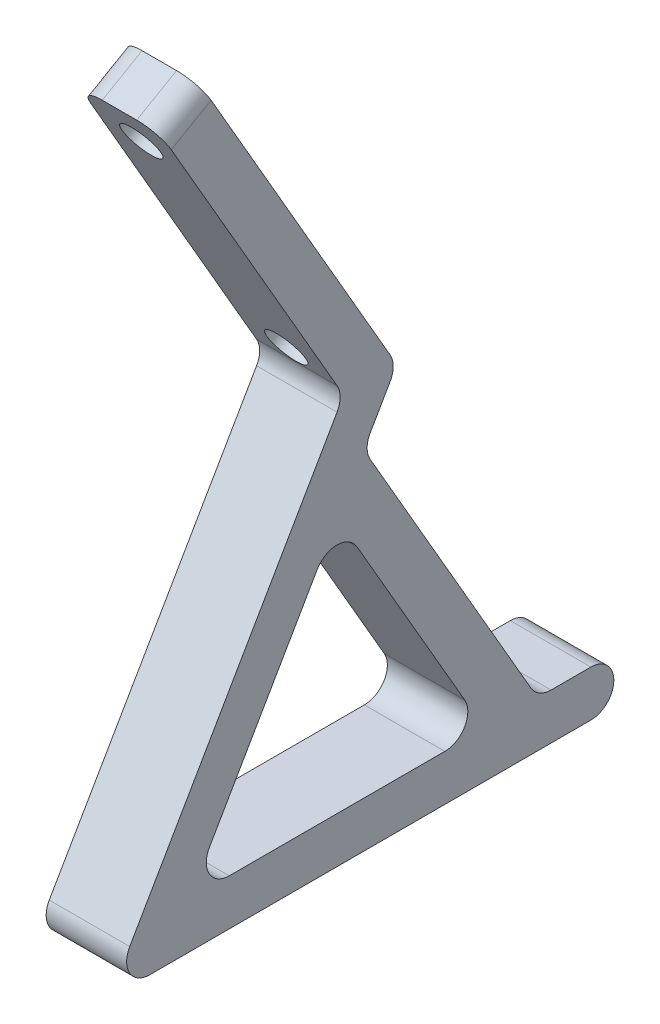
ISO-10303-21;
HEADER;
FILE_DESCRIPTION(('STEP AP214'),'2;1');
FILE_NAME('part.step','',(''),(''),'','','');
FILE_SCHEMA(('AUTOMOTIVE_DESIGN { 1 0 10303 214 1 1 1 1 }'));
ENDSEC;
DATA;
#1=APPLICATION_CONTEXT('core data for automotive mechanical design processes');
#2=APPLICATION_PROTOCOL_DEFINITION('international standard','automotive_design',2000,#1);
#3=PRODUCT_CONTEXT('',#1,'mechanical');
#4=PRODUCT('Part','Part','',(#3));
#5=PRODUCT_RELATED_PRODUCT_CATEGORY('part','',(#4));
#6=PRODUCT_DEFINITION_FORMATION('','',#4);
#7=PRODUCT_DEFINITION_CONTEXT('part definition',#1,'design');
#8=PRODUCT_DEFINITION('design','',#6,#7);
#9=PRODUCT_DEFINITION_SHAPE('','',#8);
#10=(LENGTH_UNIT() NAMED_UNIT(*) SI_UNIT(.MILLI.,.METRE.));
#11=(NAMED_UNIT(*) PLANE_ANGLE_UNIT() SI_UNIT($,.RADIAN.));
#12=(NAMED_UNIT(*) SI_UNIT($,.STERADIAN.) SOLID_ANGLE_UNIT());
#13=UNCERTAINTY_MEASURE_WITH_UNIT(LENGTH_MEASURE(1.E-05),#10,'distance_accuracy_value','');
#14=(GEOMETRIC_REPRESENTATION_CONTEXT(3) GLOBAL_UNCERTAINTY_ASSIGNED_CONTEXT((#13)) GLOBAL_UNIT_ASSIGNED_CONTEXT((#10,
#11,#12)) REPRESENTATION_CONTEXT('',''));
#15=CARTESIAN_POINT('',(0.,0.,0.));
#16=DIRECTION('',(0.,0.,1.));
#17=DIRECTION('',(1.,0.,0.));
#18=AXIS2_PLACEMENT_3D('',#15,#16,#17);
#19=CARTESIAN_POINT('',(7.,0.,0.));
#20=DIRECTION('',(-1.,0.,0.));
#21=DIRECTION('',(0.,0.,1.));
#22=AXIS2_PLACEMENT_3D('',#19,#20,#21);
#23=PLANE('',#22);
#24=DIRECTION('',(0.,0.866025403784437,-0.500000000000003));
#25=VECTOR('',#24,1.);
#26=CARTESIAN_POINT('',(7.,35.2390923627307,20.3452994616209));
#27=LINE('',#26,#25);
#28=CARTESIAN_POINT('',(7.,31.2390923627308,22.6547005383794));
#29=VERTEX_POINT('',#28);
#30=CARTESIAN_POINT('',(7.,34.2390923627307,20.9226497308105));
#31=VERTEX_POINT('',#30);
#32=EDGE_CURVE('E375',#29,#31,#27,.T.);
#33=ORIENTED_EDGE('',*,*,#32,.T.);
#34=CARTESIAN_POINT('',(7.,35.2390923627307,22.6547005383794));
#35=DIRECTION('',(-1.,0.,0.));
#36=DIRECTION('',(0.,0.,1.));
#37=AXIS2_PLACEMENT_3D('',#34,#35,#36);
#38=CIRCLE('',#37,2.);
#39=CARTESIAN_POINT('',(7.,36.2390923627308,20.9226497308105));
#40=VERTEX_POINT('',#39);
#41=EDGE_CURVE('E269',#31,#40,#38,.F.);
#42=ORIENTED_EDGE('',*,*,#41,.T.);
#43=DIRECTION('',(0.,0.866025403784436,0.500000000000005));
#44=VECTOR('',#43,1.);
#45=CARTESIAN_POINT('',(7.,64.9519052838327,37.5000000000003));
#46=LINE('',#45,#44);
#47=CARTESIAN_POINT('',(7.,63.2198544762639,36.5000000000003));
#48=VERTEX_POINT('',#47);
#49=EDGE_CURVE('E210',#40,#48,#46,.T.);
#50=ORIENTED_EDGE('',*,*,#49,.T.);
#51=DIRECTION('',(0.,-0.500000000000001,0.866025403784438));
#52=VECTOR('',#51,1.);
#53=CARTESIAN_POINT('',(7.,63.219854476264,36.5000000000001));
#54=LINE('',#53,#52);
#55=CARTESIAN_POINT('',(7.,61.2198544762639,39.9641016151381));
#56=VERTEX_POINT('',#55);
#57=EDGE_CURVE('E262',#48,#56,#54,.T.);
#58=ORIENTED_EDGE('',*,*,#57,.T.);
#59=DIRECTION('',(0.,-0.866025403784436,-0.500000000000005));
#60=VECTOR('',#59,1.);
#61=CARTESIAN_POINT('',(7.,62.9519052838327,40.9641016151381));
#62=LINE('',#61,#60);
#63=CARTESIAN_POINT('',(7.,36.2390923627308,25.5414518843275));
#64=VERTEX_POINT('',#63);
#65=EDGE_CURVE('E349',#56,#64,#62,.T.);
#66=ORIENTED_EDGE('',*,*,#65,.T.);
#67=CARTESIAN_POINT('',(7.,35.2390923627308,27.2735026918964));
#68=DIRECTION('',(-1.,0.,0.));
#69=DIRECTION('',(0.,0.,1.));
#70=AXIS2_PLACEMENT_3D('',#67,#68,#69);
#71=CIRCLE('',#70,2.);
#72=CARTESIAN_POINT('',(7.,34.2390923627307,25.5414518843275));
#73=VERTEX_POINT('',#72);
#74=EDGE_CURVE('E11',#64,#73,#71,.T.);
#75=ORIENTED_EDGE('',*,*,#74,.T.);
#76=DIRECTION('',(0.,-0.866025403784436,0.500000000000004));
#77=VECTOR('',#76,1.);
#78=CARTESIAN_POINT('',(7.,35.2390923627308,24.9641016151379));
#79=LINE('',#78,#77);
#80=CARTESIAN_POINT('',(7.,3.00000000000001,43.5773502691899));
#81=VERTEX_POINT('',#80);
#82=EDGE_CURVE('E347',#73,#81,#79,.T.);
#83=ORIENTED_EDGE('',*,*,#82,.T.);
#84=CARTESIAN_POINT('',(7.,2.,41.845299461621));
#85=DIRECTION('',(-1.,0.,0.));
#86=DIRECTION('',(0.,0.,1.));
#87=AXIS2_PLACEMENT_3D('',#84,#85,#86);
#88=CIRCLE('',#87,2.);
#89=CARTESIAN_POINT('',(7.,0.,41.845299461621));
#90=VERTEX_POINT('',#89);
#91=EDGE_CURVE('E260',#81,#90,#88,.F.);
#92=ORIENTED_EDGE('',*,*,#91,.T.);
#93=DIRECTION('',(0.,0.,-1.));
#94=VECTOR('',#93,1.);
#95=CARTESIAN_POINT('',(7.,0.,45.3094010767588));
#96=LINE('',#95,#94);
#97=CARTESIAN_POINT('',(7.,0.,3.46410161513777));
#98=VERTEX_POINT('',#97);
#99=EDGE_CURVE('E237',#90,#98,#96,.T.);
#100=ORIENTED_EDGE('',*,*,#99,.T.);
#101=CARTESIAN_POINT('',(7.,2.,3.46410161513777));
#102=DIRECTION('',(-1.,0.,0.));
#103=DIRECTION('',(0.,0.,1.));
#104=AXIS2_PLACEMENT_3D('',#101,#102,#103);
#105=CIRCLE('',#104,2.);
#106=CARTESIAN_POINT('',(7.,3.00000000000001,1.7320508075689));
#107=VERTEX_POINT('',#106);
#108=EDGE_CURVE('E265',#98,#107,#105,.F.);
#109=ORIENTED_EDGE('',*,*,#108,.T.);
#110=CARTESIAN_POINT('',(7.,2.,3.46410161513777));
#111=DIRECTION('',(-1.,0.,0.));
#112=DIRECTION('',(0.,0.,1.));
#113=AXIS2_PLACEMENT_3D('',#110,#111,#112);
#114=CIRCLE('',#113,2.);
#115=CARTESIAN_POINT('',(7.,4.,3.46410161513777));
#116=VERTEX_POINT('',#115);
#117=EDGE_CURVE('E267',#107,#116,#114,.F.);
#118=ORIENTED_EDGE('',*,*,#117,.T.);
#119=DIRECTION('',(0.,0.,1.));
#120=VECTOR('',#119,1.);
#121=CARTESIAN_POINT('',(7.,4.,8.0829037686548));
#122=LINE('',#121,#120);
#123=CARTESIAN_POINT('',(7.,4.,6.92820323027556));
#124=VERTEX_POINT('',#123);
#125=EDGE_CURVE('E233',#116,#124,#122,.T.);
#126=ORIENTED_EDGE('',*,*,#125,.T.);
#127=CARTESIAN_POINT('',(7.,6.,6.92820323027556));
#128=DIRECTION('',(-1.,0.,0.));
#129=DIRECTION('',(0.,0.,1.));
#130=AXIS2_PLACEMENT_3D('',#127,#128,#129);
#131=CIRCLE('',#130,2.);
#132=CARTESIAN_POINT('',(7.,5.,8.66025403784443));
#133=VERTEX_POINT('',#132);
#134=EDGE_CURVE('E320',#124,#133,#131,.T.);
#135=ORIENTED_EDGE('',*,*,#134,.T.);
#136=DIRECTION('',(0.,0.866025403784436,0.500000000000004));
#137=VECTOR('',#136,1.);
#138=CARTESIAN_POINT('',(7.,30.2390923627308,23.232050807569));
#139=LINE('',#138,#137);
#140=CARTESIAN_POINT('',(7.,29.2390923627308,22.6547005383794));
#141=VERTEX_POINT('',#140);
#142=EDGE_CURVE('E376',#133,#141,#139,.T.);
#143=ORIENTED_EDGE('',*,*,#142,.T.);
#144=CARTESIAN_POINT('',(7.,30.2390923627308,20.9226497308105));
#145=DIRECTION('',(-1.,0.,0.));
#146=DIRECTION('',(0.,0.,1.));
#147=AXIS2_PLACEMENT_3D('',#144,#145,#146);
#148=CIRCLE('',#147,2.);
#149=EDGE_CURVE('E316',#141,#29,#148,.T.);
#150=ORIENTED_EDGE('',*,*,#149,.T.);
#151=EDGE_LOOP('',(#33,#42,#50,#58,#66,#75,#83,#92,#100,#109,#118,#126,#135,#143,#150));
#152=FACE_BOUND('',#151,.T.);
#153=DIRECTION('',(0.,-0.866025403784437,0.500000000000003));
#154=VECTOR('',#153,1.);
#155=CARTESIAN_POINT('',(7.,26.2390923627308,25.5414518843275));
#156=LINE('',#155,#154);
#157=CARTESIAN_POINT('',(7.,23.2390923627308,27.2735026918964));
#158=VERTEX_POINT('',#157);
#159=CARTESIAN_POINT('',(7.,7.,36.6491470389143));
#160=VERTEX_POINT('',#159);
#161=EDGE_CURVE('E387',#158,#160,#156,.T.);
#162=ORIENTED_EDGE('',*,*,#161,.F.);
#163=CARTESIAN_POINT('',(7.,22.2390923627308,25.5414518843275));
#164=DIRECTION('',(-1.,0.,0.));
#165=DIRECTION('',(0.,0.,1.));
#166=AXIS2_PLACEMENT_3D('',#163,#164,#165);
#167=CIRCLE('',#166,2.);
#168=CARTESIAN_POINT('',(7.,23.2390923627308,23.8094010767587));
#169=VERTEX_POINT('',#168);
#170=EDGE_CURVE('E332',#158,#169,#167,.T.);
#171=ORIENTED_EDGE('',*,*,#170,.T.);
#172=DIRECTION('',(0.,0.866025403784437,0.500000000000004));
#173=VECTOR('',#172,1.);
#174=CARTESIAN_POINT('',(7.,4.,12.7017059221718));
#175=LINE('',#174,#173);
#176=CARTESIAN_POINT('',(7.,7.00000000000001,14.4337567297407));
#177=VERTEX_POINT('',#176);
#178=EDGE_CURVE('E361',#177,#169,#175,.T.);
#179=ORIENTED_EDGE('',*,*,#178,.F.);
#180=CARTESIAN_POINT('',(7.,6.,16.1658075373096));
#181=DIRECTION('',(-1.,0.,0.));
#182=DIRECTION('',(0.,0.,1.));
#183=AXIS2_PLACEMENT_3D('',#180,#181,#182);
#184=CIRCLE('',#183,2.);
#185=CARTESIAN_POINT('',(7.,4.,16.1658075373096));
#186=VERTEX_POINT('',#185);
#187=EDGE_CURVE('E328',#177,#186,#184,.T.);
#188=ORIENTED_EDGE('',*,*,#187,.T.);
#189=DIRECTION('',(0.,0.,-1.));
#190=VECTOR('',#189,1.);
#191=CARTESIAN_POINT('',(7.,3.99999999999999,38.3811978464832));
#192=LINE('',#191,#190);
#193=CARTESIAN_POINT('',(7.,3.99999999999999,34.9170962313455));
#194=VERTEX_POINT('',#193);
#195=EDGE_CURVE('E395',#194,#186,#192,.T.);
#196=ORIENTED_EDGE('',*,*,#195,.F.);
#197=CARTESIAN_POINT('',(7.,5.99999999999999,34.9170962313455));
#198=DIRECTION('',(-1.,0.,0.));
#199=DIRECTION('',(0.,0.,1.));
#200=AXIS2_PLACEMENT_3D('',#197,#198,#199);
#201=CIRCLE('',#200,2.);
#202=EDGE_CURVE('E324',#194,#160,#201,.T.);
#203=ORIENTED_EDGE('',*,*,#202,.T.);
#204=EDGE_LOOP('',(#162,#171,#179,#188,#196,#203));
#205=FACE_BOUND('',#204,.T.);
#206=ADVANCED_FACE('F33',(#152,#205),#23,.F.);
#207=CARTESIAN_POINT('',(0.,0.,0.));
#208=DIRECTION('',(-1.,0.,0.));
#209=DIRECTION('',(0.,0.,1.));
#210=AXIS2_PLACEMENT_3D('',#207,#208,#209);
#211=PLANE('',#210);
#212=DIRECTION('',(0.,0.866025403784436,0.500000000000005));
#213=VECTOR('',#212,1.);
#214=CARTESIAN_POINT('',(0.,64.9519052838327,37.5000000000003));
#215=LINE('',#214,#213);
#216=CARTESIAN_POINT('',(0.,36.2390923627308,20.9226497308105));
#217=VERTEX_POINT('',#216);
#218=CARTESIAN_POINT('',(0.,63.2198544762639,36.5000000000003));
#219=VERTEX_POINT('',#218);
#220=EDGE_CURVE('E207',#217,#219,#215,.T.);
#221=ORIENTED_EDGE('',*,*,#220,.F.);
#222=CARTESIAN_POINT('',(0.,35.2390923627307,22.6547005383794));
#223=DIRECTION('',(-1.,0.,0.));
#224=DIRECTION('',(0.,0.,1.));
#225=AXIS2_PLACEMENT_3D('',#222,#223,#224);
#226=CIRCLE('',#225,2.);
#227=CARTESIAN_POINT('',(0.,34.2390923627307,20.9226497308105));
#228=VERTEX_POINT('',#227);
#229=EDGE_CURVE('E190',#217,#228,#226,.T.);
#230=ORIENTED_EDGE('',*,*,#229,.T.);
#231=DIRECTION('',(0.,0.866025403784437,-0.500000000000003));
#232=VECTOR('',#231,1.);
#233=CARTESIAN_POINT('',(0.,35.2390923627307,20.3452994616209));
#234=LINE('',#233,#232);
#235=CARTESIAN_POINT('',(0.,31.2390923627308,22.6547005383794));
#236=VERTEX_POINT('',#235);
#237=EDGE_CURVE('E219',#236,#228,#234,.T.);
#238=ORIENTED_EDGE('',*,*,#237,.F.);
#239=CARTESIAN_POINT('',(0.,30.2390923627308,20.9226497308105));
#240=DIRECTION('',(-1.,0.,0.));
#241=DIRECTION('',(0.,0.,1.));
#242=AXIS2_PLACEMENT_3D('',#239,#240,#241);
#243=CIRCLE('',#242,2.);
#244=CARTESIAN_POINT('',(0.,29.2390923627308,22.6547005383794));
#245=VERTEX_POINT('',#244);
#246=EDGE_CURVE('E314',#236,#245,#243,.F.);
#247=ORIENTED_EDGE('',*,*,#246,.T.);
#248=DIRECTION('',(0.,0.866025403784436,0.500000000000004));
#249=VECTOR('',#248,1.);
#250=CARTESIAN_POINT('',(0.,30.2390923627308,23.232050807569));
#251=LINE('',#250,#249);
#252=CARTESIAN_POINT('',(0.,5.,8.66025403784443));
#253=VERTEX_POINT('',#252);
#254=EDGE_CURVE('E224',#253,#245,#251,.T.);
#255=ORIENTED_EDGE('',*,*,#254,.F.);
#256=CARTESIAN_POINT('',(0.,6.,6.92820323027556));
#257=DIRECTION('',(-1.,0.,0.));
#258=DIRECTION('',(0.,0.,1.));
#259=AXIS2_PLACEMENT_3D('',#256,#257,#258);
#260=CIRCLE('',#259,2.);
#261=CARTESIAN_POINT('',(0.,4.,6.92820323027556));
#262=VERTEX_POINT('',#261);
#263=EDGE_CURVE('E318',#253,#262,#260,.F.);
#264=ORIENTED_EDGE('',*,*,#263,.T.);
#265=DIRECTION('',(0.,0.,1.));
#266=VECTOR('',#265,1.);
#267=CARTESIAN_POINT('',(0.,4.,8.0829037686548));
#268=LINE('',#267,#266);
#269=CARTESIAN_POINT('',(0.,4.,3.46410161513777));
#270=VERTEX_POINT('',#269);
#271=EDGE_CURVE('E359',#270,#262,#268,.T.);
#272=ORIENTED_EDGE('',*,*,#271,.F.);
#273=CARTESIAN_POINT('',(0.,2.,3.46410161513777));
#274=DIRECTION('',(-1.,0.,0.));
#275=DIRECTION('',(0.,0.,1.));
#276=AXIS2_PLACEMENT_3D('',#273,#274,#275);
#277=CIRCLE('',#276,2.);
#278=CARTESIAN_POINT('',(0.,3.00000000000001,1.7320508075689));
#279=VERTEX_POINT('',#278);
#280=EDGE_CURVE('E201',#270,#279,#277,.T.);
#281=ORIENTED_EDGE('',*,*,#280,.T.);
#282=CARTESIAN_POINT('',(0.,2.,3.46410161513777));
#283=DIRECTION('',(-1.,0.,0.));
#284=DIRECTION('',(0.,0.,1.));
#285=AXIS2_PLACEMENT_3D('',#282,#283,#284);
#286=CIRCLE('',#285,2.);
#287=CARTESIAN_POINT('',(0.,0.,3.46410161513777));
#288=VERTEX_POINT('',#287);
#289=EDGE_CURVE('E254',#279,#288,#286,.T.);
#290=ORIENTED_EDGE('',*,*,#289,.T.);
#291=DIRECTION('',(0.,0.,-1.));
#292=VECTOR('',#291,1.);
#293=CARTESIAN_POINT('',(0.,0.,45.3094010767588));
#294=LINE('',#293,#292);
#295=CARTESIAN_POINT('',(0.,0.,41.845299461621));
#296=VERTEX_POINT('',#295);
#297=EDGE_CURVE('E230',#296,#288,#294,.T.);
#298=ORIENTED_EDGE('',*,*,#297,.F.);
#299=CARTESIAN_POINT('',(0.,2.,41.845299461621));
#300=DIRECTION('',(-1.,0.,0.));
#301=DIRECTION('',(0.,0.,1.));
#302=AXIS2_PLACEMENT_3D('',#299,#300,#301);
#303=CIRCLE('',#302,2.);
#304=CARTESIAN_POINT('',(0.,3.00000000000001,43.5773502691899));
#305=VERTEX_POINT('',#304);
#306=EDGE_CURVE('E211',#296,#305,#303,.T.);
#307=ORIENTED_EDGE('',*,*,#306,.T.);
#308=DIRECTION('',(0.,-0.866025403784436,0.500000000000004));
#309=VECTOR('',#308,1.);
#310=CARTESIAN_POINT('',(0.,35.2390923627308,24.9641016151379));
#311=LINE('',#310,#309);
#312=CARTESIAN_POINT('',(0.,34.2390923627307,25.5414518843275));
#313=VERTEX_POINT('',#312);
#314=EDGE_CURVE('E222',#313,#305,#311,.T.);
#315=ORIENTED_EDGE('',*,*,#314,.F.);
#316=CARTESIAN_POINT('',(0.,35.2390923627308,27.2735026918964));
#317=DIRECTION('',(-1.,0.,0.));
#318=DIRECTION('',(0.,0.,1.));
#319=AXIS2_PLACEMENT_3D('',#316,#317,#318);
#320=CIRCLE('',#319,2.);
#321=CARTESIAN_POINT('',(0.,36.2390923627308,25.5414518843275));
#322=VERTEX_POINT('',#321);
#323=EDGE_CURVE('E42',#313,#322,#320,.F.);
#324=ORIENTED_EDGE('',*,*,#323,.T.);
#325=DIRECTION('',(0.,-0.866025403784436,-0.500000000000005));
#326=VECTOR('',#325,1.);
#327=CARTESIAN_POINT('',(0.,62.9519052838327,40.9641016151381));
#328=LINE('',#327,#326);
#329=CARTESIAN_POINT('',(0.,61.2198544762639,39.9641016151381));
#330=VERTEX_POINT('',#329);
#331=EDGE_CURVE('E218',#330,#322,#328,.T.);
#332=ORIENTED_EDGE('',*,*,#331,.F.);
#333=DIRECTION('',(0.,-0.500000000000001,0.866025403784438));
#334=VECTOR('',#333,1.);
#335=CARTESIAN_POINT('',(0.,63.2198544762639,36.5000000000003));
#336=LINE('',#335,#334);
#337=EDGE_CURVE('E217',#330,#219,#336,.F.);
#338=ORIENTED_EDGE('',*,*,#337,.T.);
#339=EDGE_LOOP('',(#221,#230,#238,#247,#255,#264,#272,#281,#290,#298,#307,#315,#324,#332,#338));
#340=FACE_BOUND('',#339,.T.);
#341=DIRECTION('',(0.,0.,-1.));
#342=VECTOR('',#341,1.);
#343=CARTESIAN_POINT('',(0.,3.99999999999999,38.3811978464832));
#344=LINE('',#343,#342);
#345=CARTESIAN_POINT('',(0.,3.99999999999999,34.9170962313455));
#346=VERTEX_POINT('',#345);
#347=CARTESIAN_POINT('',(0.,4.,16.1658075373096));
#348=VERTEX_POINT('',#347);
#349=EDGE_CURVE('E388',#346,#348,#344,.T.);
#350=ORIENTED_EDGE('',*,*,#349,.T.);
#351=CARTESIAN_POINT('',(0.,6.,16.1658075373096));
#352=DIRECTION('',(-1.,0.,0.));
#353=DIRECTION('',(0.,0.,1.));
#354=AXIS2_PLACEMENT_3D('',#351,#352,#353);
#355=CIRCLE('',#354,2.);
#356=CARTESIAN_POINT('',(0.,7.00000000000001,14.4337567297407));
#357=VERTEX_POINT('',#356);
#358=EDGE_CURVE('E326',#348,#357,#355,.F.);
#359=ORIENTED_EDGE('',*,*,#358,.T.);
#360=DIRECTION('',(0.,0.866025403784437,0.500000000000004));
#361=VECTOR('',#360,1.);
#362=CARTESIAN_POINT('',(0.,4.,12.7017059221718));
#363=LINE('',#362,#361);
#364=CARTESIAN_POINT('',(0.,23.2390923627308,23.8094010767587));
#365=VERTEX_POINT('',#364);
#366=EDGE_CURVE('E384',#357,#365,#363,.T.);
#367=ORIENTED_EDGE('',*,*,#366,.T.);
#368=CARTESIAN_POINT('',(0.,22.2390923627308,25.5414518843275));
#369=DIRECTION('',(-1.,0.,0.));
#370=DIRECTION('',(0.,0.,1.));
#371=AXIS2_PLACEMENT_3D('',#368,#369,#370);
#372=CIRCLE('',#371,2.);
#373=CARTESIAN_POINT('',(0.,23.2390923627308,27.2735026918964));
#374=VERTEX_POINT('',#373);
#375=EDGE_CURVE('E330',#365,#374,#372,.F.);
#376=ORIENTED_EDGE('',*,*,#375,.T.);
#377=DIRECTION('',(0.,-0.866025403784437,0.500000000000003));
#378=VECTOR('',#377,1.);
#379=CARTESIAN_POINT('',(0.,26.2390923627308,25.5414518843275));
#380=LINE('',#379,#378);
#381=CARTESIAN_POINT('',(0.,7.,36.6491470389143));
#382=VERTEX_POINT('',#381);
#383=EDGE_CURVE('E244',#374,#382,#380,.T.);
#384=ORIENTED_EDGE('',*,*,#383,.T.);
#385=CARTESIAN_POINT('',(0.,5.99999999999999,34.9170962313455));
#386=DIRECTION('',(-1.,0.,0.));
#387=DIRECTION('',(0.,0.,1.));
#388=AXIS2_PLACEMENT_3D('',#385,#386,#387);
#389=CIRCLE('',#388,2.);
#390=EDGE_CURVE('E322',#382,#346,#389,.F.);
#391=ORIENTED_EDGE('',*,*,#390,.T.);
#392=EDGE_LOOP('',(#350,#359,#367,#376,#384,#391));
#393=FACE_BOUND('',#392,.T.);
#394=ADVANCED_FACE('F214',(#340,#393),#211,.T.);
#395=CARTESIAN_POINT('',(7.,4.,8.0829037686548));
#396=DIRECTION('',(0.,-1.,0.));
#397=DIRECTION('',(0.,0.,-1.));
#398=AXIS2_PLACEMENT_3D('',#395,#396,#397);
#399=PLANE('',#398);
#400=ORIENTED_EDGE('',*,*,#271,.T.);
#401=DIRECTION('',(-1.,0.,0.));
#402=VECTOR('',#401,1.);
#403=CARTESIAN_POINT('',(7.,4.,6.92820323027556));
#404=LINE('',#403,#402);
#405=EDGE_CURVE('E279',#262,#124,#404,.F.);
#406=ORIENTED_EDGE('',*,*,#405,.T.);
#407=ORIENTED_EDGE('',*,*,#125,.F.);
#408=DIRECTION('',(-1.,0.,0.));
#409=VECTOR('',#408,1.);
#410=CARTESIAN_POINT('',(7.,4.,3.46410161513777));
#411=LINE('',#410,#409);
#412=EDGE_CURVE('E276',#116,#270,#411,.T.);
#413=ORIENTED_EDGE('',*,*,#412,.T.);
#414=EDGE_LOOP('',(#400,#406,#407,#413));
#415=FACE_BOUND('',#414,.T.);
#416=ADVANCED_FACE('F426',(#415),#399,.F.);
#417=CARTESIAN_POINT('',(7.,30.2390923627308,23.232050807569));
#418=DIRECTION('',(0.,-0.500000000000004,0.866025403784436));
#419=DIRECTION('',(0.,-0.866025403784437,-0.500000000000004));
#420=AXIS2_PLACEMENT_3D('',#417,#418,#419);
#421=PLANE('',#420);
#422=ORIENTED_EDGE('',*,*,#254,.T.);
#423=DIRECTION('',(-1.,0.,0.));
#424=VECTOR('',#423,1.);
#425=CARTESIAN_POINT('',(7.,29.2390923627308,22.6547005383794));
#426=LINE('',#425,#424);
#427=EDGE_CURVE('E274',#245,#141,#426,.F.);
#428=ORIENTED_EDGE('',*,*,#427,.T.);
#429=ORIENTED_EDGE('',*,*,#142,.F.);
#430=DIRECTION('',(-1.,0.,0.));
#431=VECTOR('',#430,1.);
#432=CARTESIAN_POINT('',(0.,4.99999999999999,8.66025403784443));
#433=LINE('',#432,#431);
#434=EDGE_CURVE('E271',#133,#253,#433,.T.);
#435=ORIENTED_EDGE('',*,*,#434,.T.);
#436=EDGE_LOOP('',(#422,#428,#429,#435));
#437=FACE_BOUND('',#436,.T.);
#438=ADVANCED_FACE('F366',(#437),#421,.F.);
#439=CARTESIAN_POINT('',(7.,35.2390923627307,20.3452994616209));
#440=DIRECTION('',(0.,0.500000000000003,0.866025403784437));
#441=DIRECTION('',(0.,-0.866025403784437,0.500000000000003));
#442=AXIS2_PLACEMENT_3D('',#439,#440,#441);
#443=PLANE('',#442);
#444=ORIENTED_EDGE('',*,*,#237,.T.);
#445=DIRECTION('',(-1.,0.,0.));
#446=VECTOR('',#445,1.);
#447=CARTESIAN_POINT('',(7.,34.2390923627307,20.9226497308105));
#448=LINE('',#447,#446);
#449=EDGE_CURVE('E195',#228,#31,#448,.F.);
#450=ORIENTED_EDGE('',*,*,#449,.T.);
#451=ORIENTED_EDGE('',*,*,#32,.F.);
#452=DIRECTION('',(-1.,0.,0.));
#453=VECTOR('',#452,1.);
#454=CARTESIAN_POINT('',(0.,31.2390923627308,22.6547005383794));
#455=LINE('',#454,#453);
#456=EDGE_CURVE('E200',#29,#236,#455,.T.);
#457=ORIENTED_EDGE('',*,*,#456,.T.);
#458=EDGE_LOOP('',(#444,#450,#451,#457));
#459=FACE_BOUND('',#458,.T.);
#460=ADVANCED_FACE('F378',(#459),#443,.F.);
#461=CARTESIAN_POINT('',(7.,64.9519052838327,37.5000000000003));
#462=DIRECTION('',(0.,-0.500000000000005,0.866025403784436));
#463=DIRECTION('',(0.,-0.866025403784436,-0.500000000000005));
#464=AXIS2_PLACEMENT_3D('',#461,#462,#463);
#465=PLANE('',#464);
#466=CARTESIAN_POINT('',(3.49999999999999,61.6610087494518,35.6000000000003));
#467=DIRECTION('',(0.,0.500000000000005,-0.866025403784436));
#468=DIRECTION('',(0.,0.866025403784436,0.500000000000005));
#469=AXIS2_PLACEMENT_3D('',#466,#467,#468);
#470=CIRCLE('',#469,1.69999999999999);
#471=CARTESIAN_POINT('',(3.49999999999999,63.1332519358854,36.4500000000003));
#472=VERTEX_POINT('',#471);
#473=EDGE_CURVE('E249',#472,#472,#470,.T.);
#474=ORIENTED_EDGE('',*,*,#473,.F.);
#475=EDGE_LOOP('',(#474));
#476=FACE_BOUND('',#475,.T.);
#477=CARTESIAN_POINT('',(3.49999999999999,39.8371685740841,23.0000000000002));
#478=DIRECTION('',(0.,0.500000000000005,-0.866025403784436));
#479=DIRECTION('',(0.,0.866025403784436,0.500000000000005));
#480=AXIS2_PLACEMENT_3D('',#477,#478,#479);
#481=CIRCLE('',#480,1.69999999999999);
#482=CARTESIAN_POINT('',(3.49999999999999,41.3094117605176,23.8500000000002));
#483=VERTEX_POINT('',#482);
#484=EDGE_CURVE('E245',#483,#483,#481,.T.);
#485=ORIENTED_EDGE('',*,*,#484,.F.);
#486=EDGE_LOOP('',(#485));
#487=FACE_BOUND('',#486,.T.);
#488=ORIENTED_EDGE('',*,*,#49,.F.);
#489=DIRECTION('',(-1.,0.,0.));
#490=VECTOR('',#489,1.);
#491=CARTESIAN_POINT('',(7.,36.2390923627308,20.9226497308105));
#492=LINE('',#491,#490);
#493=EDGE_CURVE('E194',#40,#217,#492,.T.);
#494=ORIENTED_EDGE('',*,*,#493,.T.);
#495=ORIENTED_EDGE('',*,*,#220,.T.);
#496=CARTESIAN_POINT('',(2.,63.2198544762639,36.5000000000003));
#497=DIRECTION('',(0.,-0.500000000000005,0.866025403784436));
#498=DIRECTION('',(0.,-0.866025403784436,-0.500000000000005));
#499=AXIS2_PLACEMENT_3D('',#496,#497,#498);
#500=CIRCLE('',#499,2.);
#501=CARTESIAN_POINT('',(2.,64.9519052838327,37.5000000000003));
#502=VERTEX_POINT('',#501);
#503=EDGE_CURVE('E240',#219,#502,#500,.F.);
#504=ORIENTED_EDGE('',*,*,#503,.T.);
#505=DIRECTION('',(-1.,0.,0.));
#506=VECTOR('',#505,1.);
#507=CARTESIAN_POINT('',(7.,64.9519052838327,37.5000000000003));
#508=LINE('',#507,#506);
#509=CARTESIAN_POINT('',(5.,64.9519052838327,37.5000000000003));
#510=VERTEX_POINT('',#509);
#511=EDGE_CURVE('E236',#510,#502,#508,.T.);
#512=ORIENTED_EDGE('',*,*,#511,.F.);
#513=CARTESIAN_POINT('',(5.,63.2198544762639,36.5000000000003));
#514=DIRECTION('',(0.,-0.500000000000005,0.866025403784436));
#515=DIRECTION('',(0.,-0.866025403784436,-0.500000000000005));
#516=AXIS2_PLACEMENT_3D('',#513,#514,#515);
#517=CIRCLE('',#516,2.);
#518=EDGE_CURVE('E212',#510,#48,#517,.F.);
#519=ORIENTED_EDGE('',*,*,#518,.T.);
#520=EDGE_LOOP('',(#488,#494,#495,#504,#512,#519));
#521=FACE_BOUND('',#520,.T.);
#522=ADVANCED_FACE('F206',(#476,#487,#521),#465,.F.);
#523=CARTESIAN_POINT('',(7.,64.9519052838327,37.5000000000003));
#524=DIRECTION('',(0.,-0.866025403784438,-0.500000000000001));
#525=DIRECTION('',(0.,0.500000000000001,-0.866025403784438));
#526=AXIS2_PLACEMENT_3D('',#523,#524,#525);
#527=PLANE('',#526);
#528=DIRECTION('',(-1.,0.,0.));
#529=VECTOR('',#528,1.);
#530=CARTESIAN_POINT('',(7.,62.9519052838327,40.9641016151381));
#531=LINE('',#530,#529);
#532=CARTESIAN_POINT('',(5.,62.9519052838327,40.9641016151381));
#533=VERTEX_POINT('',#532);
#534=CARTESIAN_POINT('',(2.,62.9519052838327,40.9641016151381));
#535=VERTEX_POINT('',#534);
#536=EDGE_CURVE('E234',#533,#535,#531,.T.);
#537=ORIENTED_EDGE('',*,*,#536,.F.);
#538=DIRECTION('',(0.,-0.500000000000001,0.866025403784438));
#539=VECTOR('',#538,1.);
#540=CARTESIAN_POINT('',(5.,64.9519052838327,37.5000000000003));
#541=LINE('',#540,#539);
#542=EDGE_CURVE('E292',#533,#510,#541,.F.);
#543=ORIENTED_EDGE('',*,*,#542,.T.);
#544=ORIENTED_EDGE('',*,*,#511,.T.);
#545=DIRECTION('',(0.,-0.500000000000001,0.866025403784438));
#546=VECTOR('',#545,1.);
#547=CARTESIAN_POINT('',(2.,62.9519052838327,40.9641016151381));
#548=LINE('',#547,#546);
#549=EDGE_CURVE('E290',#502,#535,#548,.T.);
#550=ORIENTED_EDGE('',*,*,#549,.T.);
#551=EDGE_LOOP('',(#537,#543,#544,#550));
#552=FACE_BOUND('',#551,.T.);
#553=ADVANCED_FACE('F455',(#552),#527,.F.);
#554=CARTESIAN_POINT('',(7.,62.9519052838327,40.9641016151381));
#555=DIRECTION('',(0.,0.500000000000005,-0.866025403784436));
#556=DIRECTION('',(0.,0.866025403784436,0.500000000000005));
#557=AXIS2_PLACEMENT_3D('',#554,#555,#556);
#558=PLANE('',#557);
#559=CARTESIAN_POINT('',(3.49999999999999,59.6610087494518,39.064101615138));
#560=DIRECTION('',(0.,0.500000000000005,-0.866025403784436));
#561=DIRECTION('',(0.,0.866025403784436,0.500000000000005));
#562=AXIS2_PLACEMENT_3D('',#559,#560,#561);
#563=CIRCLE('',#562,1.69999999999999);
#564=CARTESIAN_POINT('',(3.49999999999999,61.1332519358854,39.914101615138));
#565=VERTEX_POINT('',#564);
#566=EDGE_CURVE('E246',#565,#565,#563,.T.);
#567=ORIENTED_EDGE('',*,*,#566,.T.);
#568=EDGE_LOOP('',(#567));
#569=FACE_BOUND('',#568,.T.);
#570=CARTESIAN_POINT('',(3.49999999999999,37.8371685740841,26.4641016151379));
#571=DIRECTION('',(0.,0.500000000000005,-0.866025403784436));
#572=DIRECTION('',(0.,0.866025403784436,0.500000000000005));
#573=AXIS2_PLACEMENT_3D('',#570,#571,#572);
#574=CIRCLE('',#573,1.69999999999999);
#575=CARTESIAN_POINT('',(3.49999999999999,39.3094117605176,27.3141016151379));
#576=VERTEX_POINT('',#575);
#577=EDGE_CURVE('E241',#576,#576,#574,.T.);
#578=ORIENTED_EDGE('',*,*,#577,.T.);
#579=EDGE_LOOP('',(#578));
#580=FACE_BOUND('',#579,.T.);
#581=ORIENTED_EDGE('',*,*,#65,.F.);
#582=CARTESIAN_POINT('',(5.,61.2198544762639,39.9641016151381));
#583=DIRECTION('',(0.,0.500000000000005,-0.866025403784436));
#584=DIRECTION('',(0.,0.866025403784436,0.500000000000005));
#585=AXIS2_PLACEMENT_3D('',#582,#583,#584);
#586=CIRCLE('',#585,2.);
#587=EDGE_CURVE('E57',#56,#533,#586,.F.);
#588=ORIENTED_EDGE('',*,*,#587,.T.);
#589=ORIENTED_EDGE('',*,*,#536,.T.);
#590=CARTESIAN_POINT('',(2.,61.2198544762639,39.9641016151381));
#591=DIRECTION('',(0.,0.500000000000005,-0.866025403784436));
#592=DIRECTION('',(0.,0.866025403784436,0.500000000000005));
#593=AXIS2_PLACEMENT_3D('',#590,#591,#592);
#594=CIRCLE('',#593,2.);
#595=EDGE_CURVE('E49',#535,#330,#594,.F.);
#596=ORIENTED_EDGE('',*,*,#595,.T.);
#597=ORIENTED_EDGE('',*,*,#331,.T.);
#598=DIRECTION('',(-1.,0.,0.));
#599=VECTOR('',#598,1.);
#600=CARTESIAN_POINT('',(7.,36.2390923627308,25.5414518843276));
#601=LINE('',#600,#599);
#602=EDGE_CURVE('E286',#322,#64,#601,.F.);
#603=ORIENTED_EDGE('',*,*,#602,.T.);
#604=EDGE_LOOP('',(#581,#588,#589,#596,#597,#603));
#605=FACE_BOUND('',#604,.T.);
#606=ADVANCED_FACE('F338',(#569,#580,#605),#558,.F.);
#607=CARTESIAN_POINT('',(7.,35.2390923627308,24.9641016151379));
#608=DIRECTION('',(0.,-0.500000000000004,-0.866025403784436));
#609=DIRECTION('',(0.,0.866025403784436,-0.500000000000004));
#610=AXIS2_PLACEMENT_3D('',#607,#608,#609);
#611=PLANE('',#610);
#612=ORIENTED_EDGE('',*,*,#82,.F.);
#613=DIRECTION('',(-1.,0.,0.));
#614=VECTOR('',#613,1.);
#615=CARTESIAN_POINT('',(0.,34.2390923627307,25.5414518843275));
#616=LINE('',#615,#614);
#617=EDGE_CURVE('E311',#73,#313,#616,.T.);
#618=ORIENTED_EDGE('',*,*,#617,.T.);
#619=ORIENTED_EDGE('',*,*,#314,.T.);
#620=DIRECTION('',(-1.,0.,0.));
#621=VECTOR('',#620,1.);
#622=CARTESIAN_POINT('',(7.,3.00000000000001,43.5773502691899));
#623=LINE('',#622,#621);
#624=EDGE_CURVE('E309',#305,#81,#623,.F.);
#625=ORIENTED_EDGE('',*,*,#624,.T.);
#626=EDGE_LOOP('',(#612,#618,#619,#625));
#627=FACE_BOUND('',#626,.T.);
#628=ADVANCED_FACE('F351',(#627),#611,.F.);
#629=CARTESIAN_POINT('',(7.,0.,45.3094010767588));
#630=DIRECTION('',(0.,1.,0.));
#631=DIRECTION('',(0.,0.,1.));
#632=AXIS2_PLACEMENT_3D('',#629,#630,#631);
#633=PLANE('',#632);
#634=ORIENTED_EDGE('',*,*,#297,.T.);
#635=DIRECTION('',(-1.,0.,0.));
#636=VECTOR('',#635,1.);
#637=CARTESIAN_POINT('',(7.,0.,3.46410161513777));
#638=LINE('',#637,#636);
#639=EDGE_CURVE('E284',#288,#98,#638,.F.);
#640=ORIENTED_EDGE('',*,*,#639,.T.);
#641=ORIENTED_EDGE('',*,*,#99,.F.);
#642=DIRECTION('',(-1.,0.,0.));
#643=VECTOR('',#642,1.);
#644=CARTESIAN_POINT('',(7.,0.,41.845299461621));
#645=LINE('',#644,#643);
#646=EDGE_CURVE('E281',#90,#296,#645,.T.);
#647=ORIENTED_EDGE('',*,*,#646,.T.);
#648=EDGE_LOOP('',(#634,#640,#641,#647));
#649=FACE_BOUND('',#648,.T.);
#650=ADVANCED_FACE('F419',(#649),#633,.F.);
#651=CARTESIAN_POINT('',(7.,26.2390923627308,25.5414518843275));
#652=DIRECTION('',(0.,-0.500000000000003,-0.866025403784437));
#653=DIRECTION('',(0.,0.866025403784437,-0.500000000000003));
#654=AXIS2_PLACEMENT_3D('',#651,#652,#653);
#655=PLANE('',#654);
#656=ORIENTED_EDGE('',*,*,#161,.T.);
#657=DIRECTION('',(-1.,0.,0.));
#658=VECTOR('',#657,1.);
#659=CARTESIAN_POINT('',(0.,7.,36.6491470389143));
#660=LINE('',#659,#658);
#661=EDGE_CURVE('E296',#160,#382,#660,.T.);
#662=ORIENTED_EDGE('',*,*,#661,.T.);
#663=ORIENTED_EDGE('',*,*,#383,.F.);
#664=DIRECTION('',(-1.,0.,0.));
#665=VECTOR('',#664,1.);
#666=CARTESIAN_POINT('',(7.,23.2390923627308,27.2735026918964));
#667=LINE('',#666,#665);
#668=EDGE_CURVE('E294',#374,#158,#667,.F.);
#669=ORIENTED_EDGE('',*,*,#668,.T.);
#670=EDGE_LOOP('',(#656,#662,#663,#669));
#671=FACE_BOUND('',#670,.T.);
#672=ADVANCED_FACE('F446',(#671),#655,.T.);
#673=CARTESIAN_POINT('',(7.,3.99999999999999,38.3811978464832));
#674=DIRECTION('',(0.,1.,0.));
#675=DIRECTION('',(0.,0.,1.));
#676=AXIS2_PLACEMENT_3D('',#673,#674,#675);
#677=PLANE('',#676);
#678=ORIENTED_EDGE('',*,*,#349,.F.);
#679=DIRECTION('',(-1.,0.,0.));
#680=VECTOR('',#679,1.);
#681=CARTESIAN_POINT('',(7.,3.99999999999999,34.9170962313455));
#682=LINE('',#681,#680);
#683=EDGE_CURVE('E302',#346,#194,#682,.F.);
#684=ORIENTED_EDGE('',*,*,#683,.T.);
#685=ORIENTED_EDGE('',*,*,#195,.T.);
#686=DIRECTION('',(-1.,0.,0.));
#687=VECTOR('',#686,1.);
#688=CARTESIAN_POINT('',(0.,4.,16.1658075373096));
#689=LINE('',#688,#687);
#690=EDGE_CURVE('E299',#186,#348,#689,.T.);
#691=ORIENTED_EDGE('',*,*,#690,.T.);
#692=EDGE_LOOP('',(#678,#684,#685,#691));
#693=FACE_BOUND('',#692,.T.);
#694=ADVANCED_FACE('F485',(#693),#677,.T.);
#695=CARTESIAN_POINT('',(7.,4.,12.7017059221718));
#696=DIRECTION('',(0.,-0.500000000000004,0.866025403784437));
#697=DIRECTION('',(0.,-0.866025403784437,-0.500000000000004));
#698=AXIS2_PLACEMENT_3D('',#695,#696,#697);
#699=PLANE('',#698);
#700=ORIENTED_EDGE('',*,*,#366,.F.);
#701=DIRECTION('',(-1.,0.,0.));
#702=VECTOR('',#701,1.);
#703=CARTESIAN_POINT('',(7.,7.00000000000001,14.4337567297407));
#704=LINE('',#703,#702);
#705=EDGE_CURVE('E307',#357,#177,#704,.F.);
#706=ORIENTED_EDGE('',*,*,#705,.T.);
#707=ORIENTED_EDGE('',*,*,#178,.T.);
#708=DIRECTION('',(-1.,0.,0.));
#709=VECTOR('',#708,1.);
#710=CARTESIAN_POINT('',(0.,23.2390923627308,23.8094010767587));
#711=LINE('',#710,#709);
#712=EDGE_CURVE('E304',#169,#365,#711,.T.);
#713=ORIENTED_EDGE('',*,*,#712,.T.);
#714=EDGE_LOOP('',(#700,#706,#707,#713));
#715=FACE_BOUND('',#714,.T.);
#716=ADVANCED_FACE('F479',(#715),#699,.T.);
#717=CARTESIAN_POINT('',(3.49999999999999,39.8371685740841,23.0000000000002));
#718=DIRECTION('',(0.,0.500000000000005,-0.866025403784436));
#719=DIRECTION('',(0.,0.866025403784436,0.500000000000005));
#720=AXIS2_PLACEMENT_3D('',#717,#718,#719);
#721=CYLINDRICAL_SURFACE('',#720,1.69999999999999);
#722=ORIENTED_EDGE('',*,*,#484,.T.);
#723=EDGE_LOOP('',(#722));
#724=FACE_BOUND('',#723,.T.);
#725=ORIENTED_EDGE('',*,*,#577,.F.);
#726=EDGE_LOOP('',(#725));
#727=FACE_BOUND('',#726,.T.);
#728=ADVANCED_FACE('F474',(#724,#727),#721,.F.);
#729=CARTESIAN_POINT('',(3.49999999999999,61.6610087494518,35.6000000000003));
#730=DIRECTION('',(0.,0.500000000000005,-0.866025403784436));
#731=DIRECTION('',(0.,0.866025403784436,0.500000000000005));
#732=AXIS2_PLACEMENT_3D('',#729,#730,#731);
#733=CYLINDRICAL_SURFACE('',#732,1.69999999999999);
#734=ORIENTED_EDGE('',*,*,#473,.T.);
#735=EDGE_LOOP('',(#734));
#736=FACE_BOUND('',#735,.T.);
#737=ORIENTED_EDGE('',*,*,#566,.F.);
#738=EDGE_LOOP('',(#737));
#739=FACE_BOUND('',#738,.T.);
#740=ADVANCED_FACE('F470',(#736,#739),#733,.F.);
#741=CARTESIAN_POINT('',(7.,35.2390923627307,22.6547005383794));
#742=DIRECTION('',(-1.,0.,0.));
#743=DIRECTION('',(0.,0.,1.));
#744=AXIS2_PLACEMENT_3D('',#741,#742,#743);
#745=CYLINDRICAL_SURFACE('',#744,2.);
#746=ORIENTED_EDGE('',*,*,#41,.F.);
#747=ORIENTED_EDGE('',*,*,#449,.F.);
#748=ORIENTED_EDGE('',*,*,#229,.F.);
#749=ORIENTED_EDGE('',*,*,#493,.F.);
#750=EDGE_LOOP('',(#746,#747,#748,#749));
#751=FACE_BOUND('',#750,.T.);
#752=ADVANCED_FACE('F193',(#751),#745,.T.);
#753=CARTESIAN_POINT('',(7.,30.2390923627308,20.9226497308105));
#754=DIRECTION('',(1.,0.,0.));
#755=DIRECTION('',(0.,0.,-1.));
#756=AXIS2_PLACEMENT_3D('',#753,#754,#755);
#757=CYLINDRICAL_SURFACE('',#756,2.);
#758=ORIENTED_EDGE('',*,*,#149,.F.);
#759=ORIENTED_EDGE('',*,*,#427,.F.);
#760=ORIENTED_EDGE('',*,*,#246,.F.);
#761=ORIENTED_EDGE('',*,*,#456,.F.);
#762=EDGE_LOOP('',(#758,#759,#760,#761));
#763=FACE_BOUND('',#762,.T.);
#764=ADVANCED_FACE('F372',(#763),#757,.F.);
#765=CARTESIAN_POINT('',(7.,6.,6.92820323027556));
#766=DIRECTION('',(1.,0.,0.));
#767=DIRECTION('',(0.,0.,-1.));
#768=AXIS2_PLACEMENT_3D('',#765,#766,#767);
#769=CYLINDRICAL_SURFACE('',#768,2.);
#770=ORIENTED_EDGE('',*,*,#134,.F.);
#771=ORIENTED_EDGE('',*,*,#405,.F.);
#772=ORIENTED_EDGE('',*,*,#263,.F.);
#773=ORIENTED_EDGE('',*,*,#434,.F.);
#774=EDGE_LOOP('',(#770,#771,#772,#773));
#775=FACE_BOUND('',#774,.T.);
#776=ADVANCED_FACE('F429',(#775),#769,.F.);
#777=CARTESIAN_POINT('',(7.,2.,3.46410161513777));
#778=DIRECTION('',(-1.,0.,0.));
#779=DIRECTION('',(0.,0.,1.));
#780=AXIS2_PLACEMENT_3D('',#777,#778,#779);
#781=CYLINDRICAL_SURFACE('',#780,2.);
#782=DIRECTION('',(-1.,0.,0.));
#783=VECTOR('',#782,1.);
#784=CARTESIAN_POINT('',(7.,3.00000000000001,1.7320508075689));
#785=LINE('',#784,#783);
#786=EDGE_CURVE('E37',#107,#279,#785,.T.);
#787=ORIENTED_EDGE('',*,*,#786,.F.);
#788=ORIENTED_EDGE('',*,*,#108,.F.);
#789=ORIENTED_EDGE('',*,*,#639,.F.);
#790=ORIENTED_EDGE('',*,*,#289,.F.);
#791=EDGE_LOOP('',(#787,#788,#789,#790));
#792=FACE_BOUND('',#791,.T.);
#793=ADVANCED_FACE('F414',(#792),#781,.T.);
#794=CARTESIAN_POINT('',(7.,2.,3.46410161513777));
#795=DIRECTION('',(-1.,0.,0.));
#796=DIRECTION('',(0.,0.,1.));
#797=AXIS2_PLACEMENT_3D('',#794,#795,#796);
#798=CYLINDRICAL_SURFACE('',#797,2.);
#799=ORIENTED_EDGE('',*,*,#117,.F.);
#800=ORIENTED_EDGE('',*,*,#786,.T.);
#801=ORIENTED_EDGE('',*,*,#280,.F.);
#802=ORIENTED_EDGE('',*,*,#412,.F.);
#803=EDGE_LOOP('',(#799,#800,#801,#802));
#804=FACE_BOUND('',#803,.T.);
#805=ADVANCED_FACE('F409',(#804),#798,.T.);
#806=CARTESIAN_POINT('',(5.,63.219854476264,36.5000000000001));
#807=DIRECTION('',(0.,-0.500000000000001,0.866025403784438));
#808=DIRECTION('',(0.,-0.866025403784438,-0.500000000000001));
#809=AXIS2_PLACEMENT_3D('',#806,#807,#808);
#810=CYLINDRICAL_SURFACE('',#809,2.);
#811=ORIENTED_EDGE('',*,*,#518,.F.);
#812=ORIENTED_EDGE('',*,*,#542,.F.);
#813=ORIENTED_EDGE('',*,*,#587,.F.);
#814=ORIENTED_EDGE('',*,*,#57,.F.);
#815=EDGE_LOOP('',(#811,#812,#813,#814));
#816=FACE_BOUND('',#815,.T.);
#817=ADVANCED_FACE('F559',(#816),#810,.T.);
#818=CARTESIAN_POINT('',(2.,63.2198544762639,36.5000000000003));
#819=DIRECTION('',(0.,0.500000000000001,-0.866025403784438));
#820=DIRECTION('',(0.,0.866025403784438,0.500000000000001));
#821=AXIS2_PLACEMENT_3D('',#818,#819,#820);
#822=CYLINDRICAL_SURFACE('',#821,2.);
#823=ORIENTED_EDGE('',*,*,#503,.F.);
#824=ORIENTED_EDGE('',*,*,#337,.F.);
#825=ORIENTED_EDGE('',*,*,#595,.F.);
#826=ORIENTED_EDGE('',*,*,#549,.F.);
#827=EDGE_LOOP('',(#823,#824,#825,#826));
#828=FACE_BOUND('',#827,.T.);
#829=ADVANCED_FACE('F521',(#828),#822,.T.);
#830=CARTESIAN_POINT('',(7.,5.99999999999999,34.9170962313455));
#831=DIRECTION('',(1.,0.,0.));
#832=DIRECTION('',(0.,0.,-1.));
#833=AXIS2_PLACEMENT_3D('',#830,#831,#832);
#834=CYLINDRICAL_SURFACE('',#833,2.);
#835=ORIENTED_EDGE('',*,*,#202,.F.);
#836=ORIENTED_EDGE('',*,*,#683,.F.);
#837=ORIENTED_EDGE('',*,*,#390,.F.);
#838=ORIENTED_EDGE('',*,*,#661,.F.);
#839=EDGE_LOOP('',(#835,#836,#837,#838));
#840=FACE_BOUND('',#839,.T.);
#841=ADVANCED_FACE('F499',(#840),#834,.F.);
#842=CARTESIAN_POINT('',(7.,6.,16.1658075373096));
#843=DIRECTION('',(1.,0.,0.));
#844=DIRECTION('',(0.,0.,-1.));
#845=AXIS2_PLACEMENT_3D('',#842,#843,#844);
#846=CYLINDRICAL_SURFACE('',#845,2.);
#847=ORIENTED_EDGE('',*,*,#187,.F.);
#848=ORIENTED_EDGE('',*,*,#705,.F.);
#849=ORIENTED_EDGE('',*,*,#358,.F.);
#850=ORIENTED_EDGE('',*,*,#690,.F.);
#851=EDGE_LOOP('',(#847,#848,#849,#850));
#852=FACE_BOUND('',#851,.T.);
#853=ADVANCED_FACE('F513',(#852),#846,.F.);
#854=CARTESIAN_POINT('',(7.,22.2390923627308,25.5414518843275));
#855=DIRECTION('',(1.,0.,0.));
#856=DIRECTION('',(0.,0.,-1.));
#857=AXIS2_PLACEMENT_3D('',#854,#855,#856);
#858=CYLINDRICAL_SURFACE('',#857,2.);
#859=ORIENTED_EDGE('',*,*,#170,.F.);
#860=ORIENTED_EDGE('',*,*,#668,.F.);
#861=ORIENTED_EDGE('',*,*,#375,.F.);
#862=ORIENTED_EDGE('',*,*,#712,.F.);
#863=EDGE_LOOP('',(#859,#860,#861,#862));
#864=FACE_BOUND('',#863,.T.);
#865=ADVANCED_FACE('F506',(#864),#858,.F.);
#866=CARTESIAN_POINT('',(7.,35.2390923627308,27.2735026918964));
#867=DIRECTION('',(1.,0.,0.));
#868=DIRECTION('',(0.,0.,-1.));
#869=AXIS2_PLACEMENT_3D('',#866,#867,#868);
#870=CYLINDRICAL_SURFACE('',#869,2.);
#871=ORIENTED_EDGE('',*,*,#74,.F.);
#872=ORIENTED_EDGE('',*,*,#602,.F.);
#873=ORIENTED_EDGE('',*,*,#323,.F.);
#874=ORIENTED_EDGE('',*,*,#617,.F.);
#875=EDGE_LOOP('',(#871,#872,#873,#874));
#876=FACE_BOUND('',#875,.T.);
#877=ADVANCED_FACE('F341',(#876),#870,.F.);
#878=CARTESIAN_POINT('',(7.,2.,41.845299461621));
#879=DIRECTION('',(-1.,0.,0.));
#880=DIRECTION('',(0.,0.,1.));
#881=AXIS2_PLACEMENT_3D('',#878,#879,#880);
#882=CYLINDRICAL_SURFACE('',#881,2.);
#883=ORIENTED_EDGE('',*,*,#91,.F.);
#884=ORIENTED_EDGE('',*,*,#624,.F.);
#885=ORIENTED_EDGE('',*,*,#306,.F.);
#886=ORIENTED_EDGE('',*,*,#646,.F.);
#887=EDGE_LOOP('',(#883,#884,#885,#886));
#888=FACE_BOUND('',#887,.T.);
#889=ADVANCED_FACE('F35',(#888),#882,.T.);
#890=CLOSED_SHELL('',(#206,#394,#416,#438,#460,#522,#553,#606,#628,#650,#672,#694,#716,#728,
#740,#752,#764,#776,#793,#805,#817,#829,#841,#853,#865,#877,#889));
#891=MANIFOLD_SOLID_BREP('B2',#890);
#892=ADVANCED_BREP_SHAPE_REPRESENTATION('',(#18,#891),#14);
#893=SHAPE_DEFINITION_REPRESENTATION(#9,#892);
ENDSEC;
END-ISO-10303-21;
